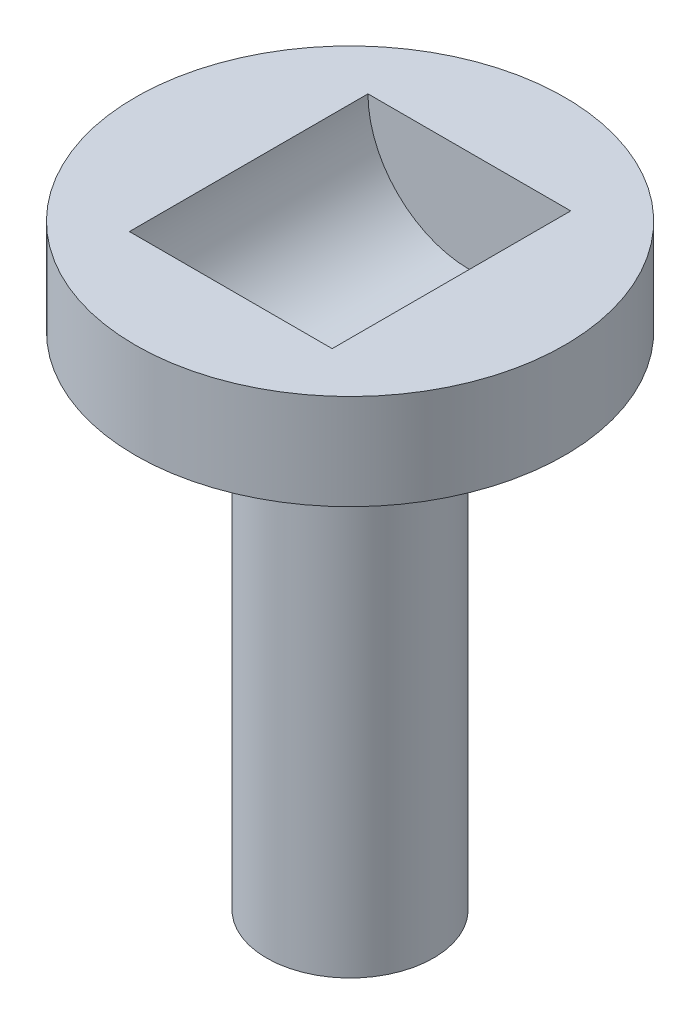
ISO-10303-21;
HEADER;
FILE_DESCRIPTION(('STEP AP214'),'2;1');
FILE_NAME('part.step','',(''),(''),'','','');
FILE_SCHEMA(('AUTOMOTIVE_DESIGN { 1 0 10303 214 1 1 1 1 }'));
ENDSEC;
DATA;
#1=APPLICATION_CONTEXT('core data for automotive mechanical design processes');
#2=APPLICATION_PROTOCOL_DEFINITION('international standard','automotive_design',2000,#1);
#3=PRODUCT_CONTEXT('',#1,'mechanical');
#4=PRODUCT('Part','Part','',(#3));
#5=PRODUCT_RELATED_PRODUCT_CATEGORY('part','',(#4));
#6=PRODUCT_DEFINITION_FORMATION('','',#4);
#7=PRODUCT_DEFINITION_CONTEXT('part definition',#1,'design');
#8=PRODUCT_DEFINITION('design','',#6,#7);
#9=PRODUCT_DEFINITION_SHAPE('','',#8);
#10=(LENGTH_UNIT() NAMED_UNIT(*) SI_UNIT(.MILLI.,.METRE.));
#11=(NAMED_UNIT(*) PLANE_ANGLE_UNIT() SI_UNIT($,.RADIAN.));
#12=(NAMED_UNIT(*) SI_UNIT($,.STERADIAN.) SOLID_ANGLE_UNIT());
#13=UNCERTAINTY_MEASURE_WITH_UNIT(LENGTH_MEASURE(1.E-05),#10,'distance_accuracy_value','');
#14=(GEOMETRIC_REPRESENTATION_CONTEXT(3) GLOBAL_UNCERTAINTY_ASSIGNED_CONTEXT((#13)) GLOBAL_UNIT_ASSIGNED_CONTEXT((#10,
#11,#12)) REPRESENTATION_CONTEXT('',''));
#15=CARTESIAN_POINT('',(0.,0.,0.));
#16=DIRECTION('',(0.,0.,1.));
#17=DIRECTION('',(1.,0.,0.));
#18=AXIS2_PLACEMENT_3D('',#15,#16,#17);
#19=CARTESIAN_POINT('',(0.,20.,0.));
#20=DIRECTION('',(0.,-1.,0.));
#21=DIRECTION('',(0.,0.,-1.));
#22=AXIS2_PLACEMENT_3D('',#19,#20,#21);
#23=CYLINDRICAL_SURFACE('',#22,3.5);
#24=CARTESIAN_POINT('',(0.,20.,0.));
#25=DIRECTION('',(0.,1.,0.));
#26=DIRECTION('',(0.,0.,1.));
#27=AXIS2_PLACEMENT_3D('',#24,#25,#26);
#28=CIRCLE('',#27,3.5);
#29=CARTESIAN_POINT('',(0.,20.,3.5));
#30=VERTEX_POINT('',#29);
#31=EDGE_CURVE('E63',#30,#30,#28,.T.);
#32=ORIENTED_EDGE('',*,*,#31,.F.);
#33=EDGE_LOOP('',(#32));
#34=FACE_BOUND('',#33,.T.);
#35=CARTESIAN_POINT('',(0.,0.,0.));
#36=DIRECTION('',(0.,1.,0.));
#37=DIRECTION('',(0.,0.,1.));
#38=AXIS2_PLACEMENT_3D('',#35,#36,#37);
#39=CIRCLE('',#38,3.5);
#40=CARTESIAN_POINT('',(0.,0.,3.5));
#41=VERTEX_POINT('',#40);
#42=EDGE_CURVE('E74',#41,#41,#39,.T.);
#43=ORIENTED_EDGE('',*,*,#42,.T.);
#44=EDGE_LOOP('',(#43));
#45=FACE_BOUND('',#44,.T.);
#46=ADVANCED_FACE('F33',(#34,#45),#23,.T.);
#47=CARTESIAN_POINT('',(0.,0.,0.));
#48=DIRECTION('',(0.,1.,0.));
#49=DIRECTION('',(0.,0.,1.));
#50=AXIS2_PLACEMENT_3D('',#47,#48,#49);
#51=PLANE('',#50);
#52=CARTESIAN_POINT('',(0.,0.,0.));
#53=DIRECTION('',(0.,-1.,0.));
#54=DIRECTION('',(0.,0.,-1.));
#55=AXIS2_PLACEMENT_3D('',#52,#53,#54);
#56=CIRCLE('',#55,0.75);
#57=CARTESIAN_POINT('',(0.,0.,-0.75));
#58=VERTEX_POINT('',#57);
#59=EDGE_CURVE('E92',#58,#58,#56,.T.);
#60=ORIENTED_EDGE('',*,*,#59,.F.);
#61=EDGE_LOOP('',(#60));
#62=FACE_BOUND('',#61,.T.);
#63=ORIENTED_EDGE('',*,*,#42,.F.);
#64=EDGE_LOOP('',(#63));
#65=FACE_BOUND('',#64,.T.);
#66=ADVANCED_FACE('F106',(#62,#65),#51,.F.);
#67=CARTESIAN_POINT('',(0.,21.,0.));
#68=DIRECTION('',(0.,-1.,0.));
#69=DIRECTION('',(0.,0.,-1.));
#70=AXIS2_PLACEMENT_3D('',#67,#68,#69);
#71=CYLINDRICAL_SURFACE('',#70,7.5);
#72=CARTESIAN_POINT('',(0.,21.,0.));
#73=DIRECTION('',(0.,1.,0.));
#74=DIRECTION('',(0.,0.,1.));
#75=AXIS2_PLACEMENT_3D('',#72,#73,#74);
#76=CIRCLE('',#75,7.5);
#77=CARTESIAN_POINT('',(0.,21.,7.5));
#78=VERTEX_POINT('',#77);
#79=EDGE_CURVE('E77',#78,#78,#76,.T.);
#80=ORIENTED_EDGE('',*,*,#79,.F.);
#81=EDGE_LOOP('',(#80));
#82=FACE_BOUND('',#81,.T.);
#83=CARTESIAN_POINT('',(0.,20.,0.));
#84=DIRECTION('',(0.,1.,0.));
#85=DIRECTION('',(0.,0.,1.));
#86=AXIS2_PLACEMENT_3D('',#83,#84,#85);
#87=CIRCLE('',#86,7.5);
#88=CARTESIAN_POINT('',(0.,20.,7.5));
#89=VERTEX_POINT('',#88);
#90=EDGE_CURVE('E80',#89,#89,#87,.T.);
#91=ORIENTED_EDGE('',*,*,#90,.T.);
#92=EDGE_LOOP('',(#91));
#93=FACE_BOUND('',#92,.T.);
#94=ADVANCED_FACE('F109',(#82,#93),#71,.T.);
#95=CARTESIAN_POINT('',(0.,20.,0.));
#96=DIRECTION('',(0.,1.,0.));
#97=DIRECTION('',(0.,0.,1.));
#98=AXIS2_PLACEMENT_3D('',#95,#96,#97);
#99=PLANE('',#98);
#100=ORIENTED_EDGE('',*,*,#31,.T.);
#101=EDGE_LOOP('',(#100));
#102=FACE_BOUND('',#101,.T.);
#103=ORIENTED_EDGE('',*,*,#90,.F.);
#104=EDGE_LOOP('',(#103));
#105=FACE_BOUND('',#104,.T.);
#106=ADVANCED_FACE('F118',(#102,#105),#99,.F.);
#107=CARTESIAN_POINT('',(0.,25.,0.));
#108=DIRECTION('',(0.,-1.,0.));
#109=DIRECTION('',(0.,0.,-1.));
#110=AXIS2_PLACEMENT_3D('',#107,#108,#109);
#111=CYLINDRICAL_SURFACE('',#110,9.);
#112=CARTESIAN_POINT('',(0.,25.,0.));
#113=DIRECTION('',(0.,1.,0.));
#114=DIRECTION('',(0.,0.,1.));
#115=AXIS2_PLACEMENT_3D('',#112,#113,#114);
#116=CIRCLE('',#115,9.);
#117=CARTESIAN_POINT('',(0.,25.,9.));
#118=VERTEX_POINT('',#117);
#119=EDGE_CURVE('E83',#118,#118,#116,.T.);
#120=ORIENTED_EDGE('',*,*,#119,.F.);
#121=EDGE_LOOP('',(#120));
#122=FACE_BOUND('',#121,.T.);
#123=CARTESIAN_POINT('',(0.,21.,0.));
#124=DIRECTION('',(0.,1.,0.));
#125=DIRECTION('',(0.,0.,1.));
#126=AXIS2_PLACEMENT_3D('',#123,#124,#125);
#127=CIRCLE('',#126,9.);
#128=CARTESIAN_POINT('',(0.,21.,9.));
#129=VERTEX_POINT('',#128);
#130=EDGE_CURVE('E86',#129,#129,#127,.T.);
#131=ORIENTED_EDGE('',*,*,#130,.T.);
#132=EDGE_LOOP('',(#131));
#133=FACE_BOUND('',#132,.T.);
#134=ADVANCED_FACE('F121',(#122,#133),#111,.T.);
#135=CARTESIAN_POINT('',(0.,25.,0.));
#136=DIRECTION('',(0.,1.,0.));
#137=DIRECTION('',(0.,0.,1.));
#138=AXIS2_PLACEMENT_3D('',#135,#136,#137);
#139=PLANE('',#138);
#140=DIRECTION('',(1.,0.,0.));
#141=VECTOR('',#140,1.);
#142=CARTESIAN_POINT('',(0.,25.,5.));
#143=LINE('',#142,#141);
#144=CARTESIAN_POINT('',(-4.25,25.,5.));
#145=VERTEX_POINT('',#144);
#146=CARTESIAN_POINT('',(4.25,25.,5.));
#147=VERTEX_POINT('',#146);
#148=EDGE_CURVE('E11',#145,#147,#143,.T.);
#149=ORIENTED_EDGE('',*,*,#148,.F.);
#150=DIRECTION('',(0.,0.,-1.));
#151=VECTOR('',#150,1.);
#152=CARTESIAN_POINT('',(-4.25,25.,5.));
#153=LINE('',#152,#151);
#154=CARTESIAN_POINT('',(-4.25,25.,-5.));
#155=VERTEX_POINT('',#154);
#156=EDGE_CURVE('E53',#145,#155,#153,.T.);
#157=ORIENTED_EDGE('',*,*,#156,.T.);
#158=DIRECTION('',(1.,0.,0.));
#159=VECTOR('',#158,1.);
#160=CARTESIAN_POINT('',(0.,25.,-5.));
#161=LINE('',#160,#159);
#162=CARTESIAN_POINT('',(4.25,25.,-5.));
#163=VERTEX_POINT('',#162);
#164=EDGE_CURVE('E59',#155,#163,#161,.T.);
#165=ORIENTED_EDGE('',*,*,#164,.T.);
#166=DIRECTION('',(0.,0.,-1.));
#167=VECTOR('',#166,1.);
#168=CARTESIAN_POINT('',(4.25,25.,5.));
#169=LINE('',#168,#167);
#170=EDGE_CURVE('E40',#163,#147,#169,.F.);
#171=ORIENTED_EDGE('',*,*,#170,.T.);
#172=EDGE_LOOP('',(#149,#157,#165,#171));
#173=FACE_BOUND('',#172,.T.);
#174=ORIENTED_EDGE('',*,*,#119,.T.);
#175=EDGE_LOOP('',(#174));
#176=FACE_BOUND('',#175,.T.);
#177=ADVANCED_FACE('F70',(#173,#176),#139,.T.);
#178=CARTESIAN_POINT('',(0.,21.,0.));
#179=DIRECTION('',(0.,1.,0.));
#180=DIRECTION('',(0.,0.,1.));
#181=AXIS2_PLACEMENT_3D('',#178,#179,#180);
#182=PLANE('',#181);
#183=ORIENTED_EDGE('',*,*,#79,.T.);
#184=EDGE_LOOP('',(#183));
#185=FACE_BOUND('',#184,.T.);
#186=ORIENTED_EDGE('',*,*,#130,.F.);
#187=EDGE_LOOP('',(#186));
#188=FACE_BOUND('',#187,.T.);
#189=ADVANCED_FACE('F135',(#185,#188),#182,.F.);
#190=CARTESIAN_POINT('',(0.,25.,5.));
#191=DIRECTION('',(0.,0.,-1.));
#192=DIRECTION('',(-1.,0.,0.));
#193=AXIS2_PLACEMENT_3D('',#190,#191,#192);
#194=CYLINDRICAL_SURFACE('',#193,4.25);
#195=CARTESIAN_POINT('',(0.,25.,-5.));
#196=DIRECTION('',(0.,0.,1.));
#197=DIRECTION('',(1.,0.,0.));
#198=AXIS2_PLACEMENT_3D('',#195,#196,#197);
#199=CIRCLE('',#198,4.25);
#200=EDGE_CURVE('E46',#155,#163,#199,.T.);
#201=ORIENTED_EDGE('',*,*,#200,.F.);
#202=ORIENTED_EDGE('',*,*,#156,.F.);
#203=CARTESIAN_POINT('',(0.,25.,5.));
#204=DIRECTION('',(0.,0.,1.));
#205=DIRECTION('',(1.,0.,0.));
#206=AXIS2_PLACEMENT_3D('',#203,#204,#205);
#207=CIRCLE('',#206,4.25);
#208=EDGE_CURVE('E66',#145,#147,#207,.T.);
#209=ORIENTED_EDGE('',*,*,#208,.T.);
#210=ORIENTED_EDGE('',*,*,#170,.F.);
#211=EDGE_LOOP('',(#201,#202,#209,#210));
#212=FACE_BOUND('',#211,.T.);
#213=ADVANCED_FACE('F65',(#212),#194,.F.);
#214=CARTESIAN_POINT('',(0.,25.,5.));
#215=DIRECTION('',(0.,0.,1.));
#216=DIRECTION('',(1.,0.,0.));
#217=AXIS2_PLACEMENT_3D('',#214,#215,#216);
#218=PLANE('',#217);
#219=ORIENTED_EDGE('',*,*,#148,.T.);
#220=ORIENTED_EDGE('',*,*,#208,.F.);
#221=EDGE_LOOP('',(#219,#220));
#222=FACE_BOUND('',#221,.T.);
#223=ADVANCED_FACE('F143',(#222),#218,.F.);
#224=CARTESIAN_POINT('',(0.,25.,-5.));
#225=DIRECTION('',(0.,0.,1.));
#226=DIRECTION('',(1.,0.,0.));
#227=AXIS2_PLACEMENT_3D('',#224,#225,#226);
#228=PLANE('',#227);
#229=ORIENTED_EDGE('',*,*,#200,.T.);
#230=ORIENTED_EDGE('',*,*,#164,.F.);
#231=EDGE_LOOP('',(#229,#230));
#232=FACE_BOUND('',#231,.T.);
#233=ADVANCED_FACE('F60',(#232),#228,.T.);
#234=CARTESIAN_POINT('',(0.,5.,0.));
#235=DIRECTION('',(0.,-1.,0.));
#236=DIRECTION('',(0.,0.,-1.));
#237=AXIS2_PLACEMENT_3D('',#234,#235,#236);
#238=CYLINDRICAL_SURFACE('',#237,0.75);
#239=CARTESIAN_POINT('',(0.,5.,0.));
#240=DIRECTION('',(0.,-1.,0.));
#241=DIRECTION('',(0.,0.,-1.));
#242=AXIS2_PLACEMENT_3D('',#239,#240,#241);
#243=CIRCLE('',#242,0.75);
#244=CARTESIAN_POINT('',(0.,5.,-0.75));
#245=VERTEX_POINT('',#244);
#246=EDGE_CURVE('E67',#245,#245,#243,.T.);
#247=ORIENTED_EDGE('',*,*,#246,.F.);
#248=EDGE_LOOP('',(#247));
#249=FACE_BOUND('',#248,.T.);
#250=ORIENTED_EDGE('',*,*,#59,.T.);
#251=EDGE_LOOP('',(#250));
#252=FACE_BOUND('',#251,.T.);
#253=ADVANCED_FACE('F100',(#249,#252),#238,.F.);
#254=CARTESIAN_POINT('',(0.,5.,0.));
#255=DIRECTION('',(0.,-1.,0.));
#256=DIRECTION('',(0.,0.,-1.));
#257=AXIS2_PLACEMENT_3D('',#254,#255,#256);
#258=PLANE('',#257);
#259=ORIENTED_EDGE('',*,*,#246,.T.);
#260=EDGE_LOOP('',(#259));
#261=FACE_BOUND('',#260,.T.);
#262=ADVANCED_FACE('F98',(#261),#258,.T.);
#263=CLOSED_SHELL('',(#46,#66,#94,#106,#134,#177,#189,#213,#223,#233,#253,#262));
#264=MANIFOLD_SOLID_BREP('B2',#263);
#265=ADVANCED_BREP_SHAPE_REPRESENTATION('',(#18,#264),#14);
#266=SHAPE_DEFINITION_REPRESENTATION(#9,#265);
ENDSEC;
END-ISO-10303-21;
